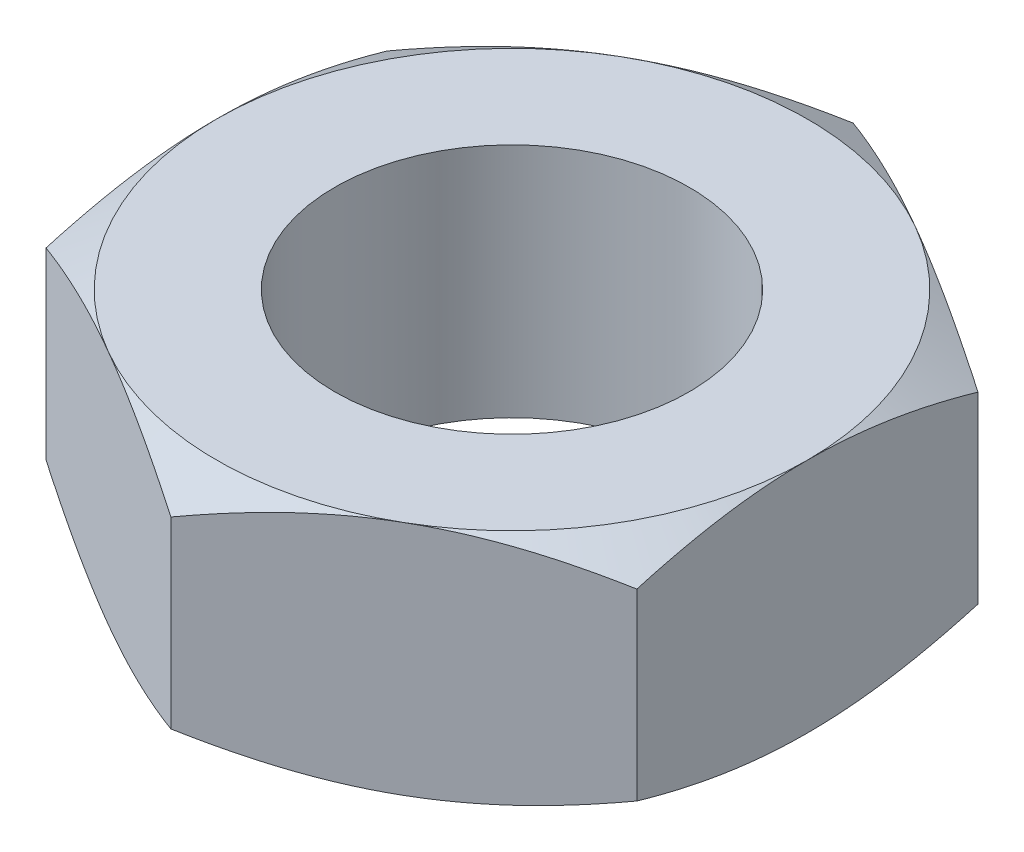
ISO-10303-21;
HEADER;
FILE_DESCRIPTION(('STEP AP214'),'2;1');
FILE_NAME('part.step','',(''),(''),'','','');
FILE_SCHEMA(('AUTOMOTIVE_DESIGN { 1 0 10303 214 1 1 1 1 }'));
ENDSEC;
DATA;
#1=APPLICATION_CONTEXT('core data for automotive mechanical design processes');
#2=APPLICATION_PROTOCOL_DEFINITION('international standard','automotive_design',2000,#1);
#3=PRODUCT_CONTEXT('',#1,'mechanical');
#4=PRODUCT('Part','Part','',(#3));
#5=PRODUCT_RELATED_PRODUCT_CATEGORY('part','',(#4));
#6=PRODUCT_DEFINITION_FORMATION('','',#4);
#7=PRODUCT_DEFINITION_CONTEXT('part definition',#1,'design');
#8=PRODUCT_DEFINITION('design','',#6,#7);
#9=PRODUCT_DEFINITION_SHAPE('','',#8);
#10=(LENGTH_UNIT() NAMED_UNIT(*) SI_UNIT(.MILLI.,.METRE.));
#11=(NAMED_UNIT(*) PLANE_ANGLE_UNIT() SI_UNIT($,.RADIAN.));
#12=(NAMED_UNIT(*) SI_UNIT($,.STERADIAN.) SOLID_ANGLE_UNIT());
#13=UNCERTAINTY_MEASURE_WITH_UNIT(LENGTH_MEASURE(1.E-05),#10,'distance_accuracy_value','');
#14=(GEOMETRIC_REPRESENTATION_CONTEXT(3) GLOBAL_UNCERTAINTY_ASSIGNED_CONTEXT((#13)) GLOBAL_UNIT_ASSIGNED_CONTEXT((#10,
#11,#12)) REPRESENTATION_CONTEXT('',''));
#15=CARTESIAN_POINT('',(0.,0.,0.));
#16=DIRECTION('',(0.,0.,1.));
#17=DIRECTION('',(1.,0.,0.));
#18=AXIS2_PLACEMENT_3D('',#15,#16,#17);
#19=CARTESIAN_POINT('',(2.5,2.,-1.44337567297407));
#20=DIRECTION('',(-0.5,0.,0.866025403784439));
#21=DIRECTION('',(0.866025403784439,0.,0.5));
#22=AXIS2_PLACEMENT_3D('',#19,#20,#21);
#23=PLANE('',#22);
#24=CARTESIAN_POINT('',(-0.000199999999999917,0.223357664359107,-2.88686681600197));
#25=CARTESIAN_POINT('',(0.109663234734871,0.186721620107625,-2.82343724785375));
#26=CARTESIAN_POINT('',(0.220474799896526,0.153402218965055,-2.75946016087834));
#27=CARTESIAN_POINT('',(0.44401683346605,0.0952422855578572,-2.63039810762178));
#28=CARTESIAN_POINT('',(0.556751274528388,0.0704223291477377,-2.5653108477275));
#29=CARTESIAN_POINT('',(0.780822993875269,0.0317856514410515,-2.43594298024479));
#30=CARTESIAN_POINT('',(0.892125791767377,0.0177117961856385,-2.37168227992023));
#31=CARTESIAN_POINT('',(1.11525522746833,0.000909152352749897,-2.24285844015415));
#32=CARTESIAN_POINT('',(1.22708105401423,-0.00183354879637364,-2.17829576909553));
#33=CARTESIAN_POINT('',(1.43604197555152,0.00386576000805342,-2.05765212479586));
#34=CARTESIAN_POINT('',(1.53320831755773,0.0109083943818616,-2.0015531110824));
#35=CARTESIAN_POINT('',(1.726907949711,0.0332314191249423,-1.88972057631678));
#36=CARTESIAN_POINT('',(1.82344056965973,0.0485194384402668,-1.8339874422038));
#37=CARTESIAN_POINT('',(2.01753972174048,0.0867390938444198,-1.7219242445005));
#38=CARTESIAN_POINT('',(2.11508168178214,0.109832776125516,-1.66560836761316));
#39=CARTESIAN_POINT('',(2.30871060807608,0.162246656577913,-1.55381665489446));
#40=CARTESIAN_POINT('',(2.40480005588618,0.191554535624548,-1.49833938633502));
#41=CARTESIAN_POINT('',(2.5002,0.223357664359108,-1.44326020292023));
#42=B_SPLINE_CURVE_WITH_KNOTS('',3,(#24,#25,#26,#27,#28,#29,#30,#31,#32,#33,#34,#35,#36,#37,#38,
#39,#40,#41),.UNSPECIFIED.,.F.,.F.,(4,2,2,2,2,2,2,2,4),(0.,0.396285827362226,0.79352433015205,
1.18093086852114,1.56786160134475,1.90479741793733,2.24204551660463,2.58677531536756,
2.93082800105256),.UNSPECIFIED.);
#43=CARTESIAN_POINT('',(0.,0.223290993692601,-2.88675134594813));
#44=VERTEX_POINT('',#43);
#45=CARTESIAN_POINT('',(1.25,0.,-2.1650635094611));
#46=VERTEX_POINT('',#45);
#47=EDGE_CURVE('E55',#44,#46,#42,.T.);
#48=ORIENTED_EDGE('',*,*,#47,.F.);
#49=DIRECTION('',(0.,-1.,0.));
#50=VECTOR('',#49,1.);
#51=CARTESIAN_POINT('',(0.,2.,-2.88675134594813));
#52=LINE('',#51,#50);
#53=CARTESIAN_POINT('',(0.,1.7767090063074,-2.88675134594813));
#54=VERTEX_POINT('',#53);
#55=EDGE_CURVE('E281',#54,#44,#52,.T.);
#56=ORIENTED_EDGE('',*,*,#55,.F.);
#57=CARTESIAN_POINT('',(2.5002,1.77664233564089,-1.44326020292023));
#58=CARTESIAN_POINT('',(2.39033676526513,1.81327837989237,-1.50668977106845));
#59=CARTESIAN_POINT('',(2.27952520010347,1.84659778103494,-1.57066685804385));
#60=CARTESIAN_POINT('',(2.05598316653395,1.90475771444214,-1.69972891130041));
#61=CARTESIAN_POINT('',(1.94324872547161,1.92957767085226,-1.7648161711947));
#62=CARTESIAN_POINT('',(1.71917700612473,1.96821434855895,-1.8941840386774));
#63=CARTESIAN_POINT('',(1.60787420823262,1.98228820381436,-1.95844473900197));
#64=CARTESIAN_POINT('',(1.38474477253167,1.99909084764725,-2.08726857876804));
#65=CARTESIAN_POINT('',(1.27291894598577,2.00183354879637,-2.15183124982667));
#66=CARTESIAN_POINT('',(1.06395802444848,1.99613423999195,-2.27247489412634));
#67=CARTESIAN_POINT('',(0.966791682442268,1.98909160561814,-2.32857390783979));
#68=CARTESIAN_POINT('',(0.773092050288997,1.96676858087506,-2.44040644260542));
#69=CARTESIAN_POINT('',(0.676559430340267,1.95148056155973,-2.4961395767184));
#70=CARTESIAN_POINT('',(0.482460278259524,1.91326090615558,-2.60820277442169));
#71=CARTESIAN_POINT('',(0.384918318217859,1.89016722387448,-2.66451865130903));
#72=CARTESIAN_POINT('',(0.191289391923915,1.83775334342209,-2.77631036402774));
#73=CARTESIAN_POINT('',(0.095199944113824,1.80844546437545,-2.83178763258717));
#74=CARTESIAN_POINT('',(-0.000199999999999958,1.77664233564089,-2.88686681600197));
#75=B_SPLINE_CURVE_WITH_KNOTS('',3,(#57,#58,#59,#60,#61,#62,#63,#64,#65,#66,#67,#68,#69,#70,#71,
#72,#73,#74),.UNSPECIFIED.,.F.,.F.,(4,2,2,2,2,2,2,2,4),(0.,0.396285827362227,0.793524330152051,
1.18093086852114,1.56786160134475,1.90479741793733,2.24204551660463,2.58677531536756,
2.93082800105256),.UNSPECIFIED.);
#76=CARTESIAN_POINT('',(1.25,2.,-2.1650635094611));
#77=VERTEX_POINT('',#76);
#78=EDGE_CURVE('E253',#77,#54,#75,.T.);
#79=ORIENTED_EDGE('',*,*,#78,.F.);
#80=CARTESIAN_POINT('',(2.5,1.7767090063074,-1.44337567297408));
#81=VERTEX_POINT('',#80);
#82=EDGE_CURVE('E321',#81,#77,#75,.T.);
#83=ORIENTED_EDGE('',*,*,#82,.F.);
#84=DIRECTION('',(0.,-1.,0.));
#85=VECTOR('',#84,1.);
#86=CARTESIAN_POINT('',(2.5,2.,-1.44337567297407));
#87=LINE('',#86,#85);
#88=CARTESIAN_POINT('',(2.5,0.223290993692601,-1.44337567297407));
#89=VERTEX_POINT('',#88);
#90=EDGE_CURVE('E323',#81,#89,#87,.T.);
#91=ORIENTED_EDGE('',*,*,#90,.T.);
#92=EDGE_CURVE('E140',#46,#89,#42,.T.);
#93=ORIENTED_EDGE('',*,*,#92,.F.);
#94=EDGE_LOOP('',(#48,#56,#79,#83,#91,#93));
#95=FACE_BOUND('',#94,.T.);
#96=ADVANCED_FACE('F39',(#95),#23,.F.);
#97=CARTESIAN_POINT('',(0.,2.,-2.88675134594813));
#98=DIRECTION('',(0.5,0.,0.866025403784439));
#99=DIRECTION('',(0.866025403784439,0.,-0.5));
#100=AXIS2_PLACEMENT_3D('',#97,#98,#99);
#101=PLANE('',#100);
#102=CARTESIAN_POINT('',(-2.5002,0.223357664359107,-1.44326020292023));
#103=CARTESIAN_POINT('',(-2.39033676526513,0.186721620107625,-1.50668977106845));
#104=CARTESIAN_POINT('',(-2.27952520010347,0.153402218965055,-1.57066685804385));
#105=CARTESIAN_POINT('',(-2.05598316653395,0.0952422855578569,-1.69972891130041));
#106=CARTESIAN_POINT('',(-1.94324872547161,0.0704223291477375,-1.7648161711947));
#107=CARTESIAN_POINT('',(-1.71917700612473,0.0317856514410513,-1.8941840386774));
#108=CARTESIAN_POINT('',(-1.60787420823262,0.0177117961856384,-1.95844473900197));
#109=CARTESIAN_POINT('',(-1.38474477253167,0.000909152352749717,-2.08726857876804));
#110=CARTESIAN_POINT('',(-1.27291894598577,-0.00183354879637401,-2.15183124982667));
#111=CARTESIAN_POINT('',(-1.06395802444848,0.00386576000805292,-2.27247489412634));
#112=CARTESIAN_POINT('',(-0.966791682442269,0.0109083943818612,-2.32857390783979));
#113=CARTESIAN_POINT('',(-0.773092050288997,0.033231419124942,-2.44040644260542));
#114=CARTESIAN_POINT('',(-0.676559430340268,0.0485194384402665,-2.49613957671839));
#115=CARTESIAN_POINT('',(-0.482460278259524,0.0867390938444195,-2.60820277442169));
#116=CARTESIAN_POINT('',(-0.384918318217859,0.109832776125516,-2.66451865130903));
#117=CARTESIAN_POINT('',(-0.191289391923915,0.162246656577912,-2.77631036402774));
#118=CARTESIAN_POINT('',(-0.0951999441138238,0.191554535624547,-2.83178763258717));
#119=CARTESIAN_POINT('',(0.000200000000000233,0.223357664359107,-2.88686681600197));
#120=B_SPLINE_CURVE_WITH_KNOTS('',3,(#102,#103,#104,#105,#106,#107,#108,#109,#110,#111,#112,
#113,#114,#115,#116,#117,#118,#119),.UNSPECIFIED.,.F.,.F.,(4,2,2,2,2,2,2,2,4),(0.,
0.396285827362227,0.793524330152051,1.18093086852114,1.56786160134475,1.90479741793733,
2.24204551660463,2.58677531536756,2.93082800105256),.UNSPECIFIED.);
#121=CARTESIAN_POINT('',(-2.5,0.223290993692601,-1.44337567297406));
#122=VERTEX_POINT('',#121);
#123=CARTESIAN_POINT('',(-1.25,0.,-2.1650635094611));
#124=VERTEX_POINT('',#123);
#125=EDGE_CURVE('E63',#122,#124,#120,.T.);
#126=ORIENTED_EDGE('',*,*,#125,.F.);
#127=DIRECTION('',(0.,-1.,0.));
#128=VECTOR('',#127,1.);
#129=CARTESIAN_POINT('',(-2.5,2.,-1.44337567297406));
#130=LINE('',#129,#128);
#131=CARTESIAN_POINT('',(-2.5,1.7767090063074,-1.44337567297406));
#132=VERTEX_POINT('',#131);
#133=EDGE_CURVE('E274',#132,#122,#130,.T.);
#134=ORIENTED_EDGE('',*,*,#133,.F.);
#135=CARTESIAN_POINT('',(0.000200000000000009,1.77664233564089,-2.88686681600197));
#136=CARTESIAN_POINT('',(-0.109663234734871,1.81327837989238,-2.82343724785375));
#137=CARTESIAN_POINT('',(-0.220474799896526,1.84659778103494,-2.75946016087834));
#138=CARTESIAN_POINT('',(-0.444016833466049,1.90475771444214,-2.63039810762178));
#139=CARTESIAN_POINT('',(-0.556751274528388,1.92957767085226,-2.5653108477275));
#140=CARTESIAN_POINT('',(-0.780822993875268,1.96821434855895,-2.43594298024479));
#141=CARTESIAN_POINT('',(-0.892125791767376,1.98228820381436,-2.37168227992023));
#142=CARTESIAN_POINT('',(-1.11525522746833,1.99909084764725,-2.24285844015415));
#143=CARTESIAN_POINT('',(-1.22708105401423,2.00183354879637,-2.17829576909552));
#144=CARTESIAN_POINT('',(-1.43604197555152,1.99613423999195,-2.05765212479586));
#145=CARTESIAN_POINT('',(-1.53320831755773,1.98909160561814,-2.0015531110824));
#146=CARTESIAN_POINT('',(-1.726907949711,1.96676858087506,-1.88972057631678));
#147=CARTESIAN_POINT('',(-1.82344056965973,1.95148056155973,-1.8339874422038));
#148=CARTESIAN_POINT('',(-2.01753972174048,1.91326090615558,-1.7219242445005));
#149=CARTESIAN_POINT('',(-2.11508168178214,1.89016722387448,-1.66560836761316));
#150=CARTESIAN_POINT('',(-2.30871060807608,1.83775334342209,-1.55381665489446));
#151=CARTESIAN_POINT('',(-2.40480005588618,1.80844546437545,-1.49833938633502));
#152=CARTESIAN_POINT('',(-2.5002,1.77664233564089,-1.44326020292023));
#153=B_SPLINE_CURVE_WITH_KNOTS('',3,(#135,#136,#137,#138,#139,#140,#141,#142,#143,#144,#145,
#146,#147,#148,#149,#150,#151,#152),.UNSPECIFIED.,.F.,.F.,(4,2,2,2,2,2,2,2,4),(0.,
0.396285827362227,0.79352433015205,1.18093086852114,1.56786160134475,1.90479741793733,
2.24204551660463,2.58677531536756,2.93082800105256),.UNSPECIFIED.);
#154=CARTESIAN_POINT('',(-1.25,2.,-2.1650635094611));
#155=VERTEX_POINT('',#154);
#156=EDGE_CURVE('E246',#155,#132,#153,.T.);
#157=ORIENTED_EDGE('',*,*,#156,.F.);
#158=EDGE_CURVE('E252',#54,#155,#153,.T.);
#159=ORIENTED_EDGE('',*,*,#158,.F.);
#160=ORIENTED_EDGE('',*,*,#55,.T.);
#161=EDGE_CURVE('E163',#124,#44,#120,.T.);
#162=ORIENTED_EDGE('',*,*,#161,.F.);
#163=EDGE_LOOP('',(#126,#134,#157,#159,#160,#162));
#164=FACE_BOUND('',#163,.T.);
#165=ADVANCED_FACE('F259',(#164),#101,.F.);
#166=CARTESIAN_POINT('',(-2.5,2.,-1.44337567297406));
#167=DIRECTION('',(1.,0.,0.));
#168=DIRECTION('',(0.,0.,-1.));
#169=AXIS2_PLACEMENT_3D('',#166,#167,#168);
#170=PLANE('',#169);
#171=CARTESIAN_POINT('',(-2.5,1.75051746805577,4.93486171933444));
#172=CARTESIAN_POINT('',(-2.5,1.69133726261722,4.8199403481942));
#173=CARTESIAN_POINT('',(-2.5,1.63247825676005,4.70485212642124));
#174=CARTESIAN_POINT('',(-2.5,1.51556406119456,4.47426567976795));
#175=CARTESIAN_POINT('',(-2.5,1.45750888635444,4.3587674473533));
#176=CARTESIAN_POINT('',(-2.5,1.34227244134488,4.12710089531368));
#177=CARTESIAN_POINT('',(-2.5,1.28509274407798,4.01093179192169));
#178=CARTESIAN_POINT('',(-2.5,1.17192590701674,3.77801122649482));
#179=CARTESIAN_POINT('',(-2.5,1.11593878415348,3.66125975622101));
#180=CARTESIAN_POINT('',(-2.5,1.00253157682963,3.42088300849687));
#181=CARTESIAN_POINT('',(-2.5,0.94519156160896,3.2972198482005));
#182=CARTESIAN_POINT('',(-2.5,0.832598686179216,3.04894788037271));
#183=CARTESIAN_POINT('',(-2.5,0.777345769924556,2.92433909834247));
#184=CARTESIAN_POINT('',(-2.5,0.669564709168184,2.67404231382757));
#185=CARTESIAN_POINT('',(-2.5,0.617034744165751,2.54835509963059));
#186=CARTESIAN_POINT('',(-2.5,0.515470603951828,2.29553518807958));
#187=CARTESIAN_POINT('',(-2.5,0.466437240853758,2.16840216282304));
#188=CARTESIAN_POINT('',(-2.5,0.36551904558916,1.89196933857389));
#189=CARTESIAN_POINT('',(-2.5,0.314430928565565,1.74237414052598));
#190=CARTESIAN_POINT('',(-2.5,0.220856049236354,1.4405551511059));
#191=CARTESIAN_POINT('',(-2.5,0.178364945289853,1.28833272889575));
#192=CARTESIAN_POINT('',(-2.5,0.105752289587979,0.983942199808397));
#193=CARTESIAN_POINT('',(-2.5,0.075408967281811,0.831829132495783));
#194=CARTESIAN_POINT('',(-2.5,0.0406516796303215,0.602071425625844));
#195=CARTESIAN_POINT('',(-2.5,0.0308592992319909,0.525228449493818));
#196=CARTESIAN_POINT('',(-2.5,0.0151636656794681,0.371150643177174));
#197=CARTESIAN_POINT('',(-2.5,0.00925981943211468,0.293915874561849));
#198=CARTESIAN_POINT('',(-2.5,0.00149945618362645,0.13817730801555));
#199=CARTESIAN_POINT('',(-2.5,-0.000300329680072945,0.0596706558577331));
#200=CARTESIAN_POINT('',(-2.5,0.000382182470508429,-0.097323703774756));
#201=CARTESIAN_POINT('',(-2.5,0.00286448024898932,-0.175811411250471));
#202=CARTESIAN_POINT('',(-2.5,0.0120180751018739,-0.332556462396659));
#203=CARTESIAN_POINT('',(-2.5,0.0186902391546215,-0.4108137550211));
#204=CARTESIAN_POINT('',(-2.5,0.0359818737124379,-0.566895759516455));
#205=CARTESIAN_POINT('',(-2.5,0.0466019878865531,-0.644720398746935));
#206=CARTESIAN_POINT('',(-2.5,0.0843776540425916,-0.880425277323257));
#207=CARTESIAN_POINT('',(-2.5,0.117244290445988,-1.0374021276822));
#208=CARTESIAN_POINT('',(-2.5,0.194551132550416,-1.34841101742391));
#209=CARTESIAN_POINT('',(-2.5,0.238994974726618,-1.50244211517955));
#210=CARTESIAN_POINT('',(-2.5,0.334467726657706,-1.80198948227857));
#211=CARTESIAN_POINT('',(-2.5,0.385183371784436,-1.94760725909514));
#212=CARTESIAN_POINT('',(-2.5,0.492317846941425,-2.23674360042291));
#213=CARTESIAN_POINT('',(-2.5,0.548738075330581,-2.38026164031033));
#214=CARTESIAN_POINT('',(-2.5,0.665809108984891,-2.66572180096044));
#215=CARTESIAN_POINT('',(-2.5,0.726464237701914,-2.80766213451906));
#216=CARTESIAN_POINT('',(-2.5,0.850881769521231,-3.0901760741915));
#217=CARTESIAN_POINT('',(-2.5,0.914644342755143,-3.23074960496675));
#218=CARTESIAN_POINT('',(-2.5,1.04081855009125,-3.50283338488746));
#219=CARTESIAN_POINT('',(-2.5,1.10310046173394,-3.63440403331771));
#220=CARTESIAN_POINT('',(-2.5,1.2292955254876,-3.89676431270017));
#221=CARTESIAN_POINT('',(-2.5,1.29320873128699,-4.02755391777178));
#222=CARTESIAN_POINT('',(-2.5,1.42210820195559,-4.28806433847912));
#223=CARTESIAN_POINT('',(-2.5,1.48709022600769,-4.41778725733017));
#224=CARTESIAN_POINT('',(-2.5,1.61808743263322,-4.67669676330922));
#225=CARTESIAN_POINT('',(-2.5,1.68410252583257,-4.8058833956229));
#226=CARTESIAN_POINT('',(-2.5,1.75051746805577,-4.93486171933444));
#227=B_SPLINE_CURVE_WITH_KNOTS('',3,(#171,#172,#173,#174,#175,#176,#177,#178,#179,#180,#181,
#182,#183,#184,#185,#186,#187,#188,#189,#190,#191,#192,#193,#194,#195,#196,#197,#198,#199,#200,
#201,#202,#203,#204,#205,#206,#207,#208,#209,#210,#211,#212,#213,#214,#215,#216,#217,#218,#219,
#220,#221,#222,#223,#224,#225,#226),.UNSPECIFIED.,.F.,.F.,(4,2,2,2,2,2,2,2,2,2,2,2,2,2,2,2,2,2,
2,2,2,2,2,2,2,2,2,4),(0.,0.387793831894924,0.775594827128251,1.16402581850152,1.5524623207934,
1.96137758264064,2.37028185592793,2.77890912291195,3.1876309897647,3.66167496284643,
4.13547893462243,4.60018855861607,4.83249783003165,5.06477166059454,5.30023727903514,
5.53570288450944,5.77121722921933,6.00676998875774,6.48725754661897,6.96789621109927,
7.43032586595213,7.89286915182352,8.35589175957823,8.81893974621792,9.25562834373433,
9.69233133192937,10.1275921173417,10.5628154528867),.UNSPECIFIED.);
#228=CARTESIAN_POINT('',(-2.5,0.223290993692601,1.44337567297407));
#229=VERTEX_POINT('',#228);
#230=CARTESIAN_POINT('',(-2.5,0.,0.));
#231=VERTEX_POINT('',#230);
#232=EDGE_CURVE('E350',#229,#231,#227,.T.);
#233=ORIENTED_EDGE('',*,*,#232,.F.);
#234=DIRECTION('',(0.,-1.,0.));
#235=VECTOR('',#234,1.);
#236=CARTESIAN_POINT('',(-2.5,2.,1.44337567297407));
#237=LINE('',#236,#235);
#238=CARTESIAN_POINT('',(-2.5,1.7767090063074,1.44337567297407));
#239=VERTEX_POINT('',#238);
#240=EDGE_CURVE('E282',#239,#229,#237,.T.);
#241=ORIENTED_EDGE('',*,*,#240,.F.);
#242=CARTESIAN_POINT('',(-2.5,0.249482531944229,-4.93486171933444));
#243=CARTESIAN_POINT('',(-2.5,0.308662737382783,-4.8199403481942));
#244=CARTESIAN_POINT('',(-2.5,0.367521743239952,-4.70485212642124));
#245=CARTESIAN_POINT('',(-2.5,0.484435938805442,-4.47426567976795));
#246=CARTESIAN_POINT('',(-2.5,0.542491113645565,-4.3587674473533));
#247=CARTESIAN_POINT('',(-2.5,0.657727558655124,-4.12710089531367));
#248=CARTESIAN_POINT('',(-2.5,0.714907255922024,-4.01093179192169));
#249=CARTESIAN_POINT('',(-2.5,0.828074092983265,-3.77801122649482));
#250=CARTESIAN_POINT('',(-2.5,0.884061215846522,-3.66125975622101));
#251=CARTESIAN_POINT('',(-2.5,0.997468423170369,-3.42088300849687));
#252=CARTESIAN_POINT('',(-2.5,1.05480843839104,-3.2972198482005));
#253=CARTESIAN_POINT('',(-2.5,1.16740131382078,-3.04894788037271));
#254=CARTESIAN_POINT('',(-2.5,1.22265423007544,-2.92433909834247));
#255=CARTESIAN_POINT('',(-2.5,1.33043529083182,-2.67404231382757));
#256=CARTESIAN_POINT('',(-2.5,1.38296525583425,-2.54835509963059));
#257=CARTESIAN_POINT('',(-2.5,1.48452939604817,-2.29553518807957));
#258=CARTESIAN_POINT('',(-2.5,1.53356275914624,-2.16840216282304));
#259=CARTESIAN_POINT('',(-2.5,1.63448095441084,-1.89196933857389));
#260=CARTESIAN_POINT('',(-2.5,1.68556907143444,-1.74237414052598));
#261=CARTESIAN_POINT('',(-2.5,1.77914395076365,-1.4405551511059));
#262=CARTESIAN_POINT('',(-2.5,1.82163505471015,-1.28833272889575));
#263=CARTESIAN_POINT('',(-2.5,1.89424771041202,-0.983942199808396));
#264=CARTESIAN_POINT('',(-2.5,1.92459103271819,-0.831829132495782));
#265=CARTESIAN_POINT('',(-2.5,1.95934832036968,-0.602071425625842));
#266=CARTESIAN_POINT('',(-2.5,1.96914070076801,-0.525228449493816));
#267=CARTESIAN_POINT('',(-2.5,1.98483633432053,-0.371150643177172));
#268=CARTESIAN_POINT('',(-2.5,1.99074018056789,-0.293915874561848));
#269=CARTESIAN_POINT('',(-2.5,1.99850054381637,-0.138177308015549));
#270=CARTESIAN_POINT('',(-2.5,2.00030032968007,-0.0596706558577319));
#271=CARTESIAN_POINT('',(-2.5,1.99961781752949,0.0973237037747572));
#272=CARTESIAN_POINT('',(-2.5,1.99713551975101,0.175811411250472));
#273=CARTESIAN_POINT('',(-2.5,1.98798192489813,0.332556462396661));
#274=CARTESIAN_POINT('',(-2.5,1.98130976084538,0.410813755021101));
#275=CARTESIAN_POINT('',(-2.5,1.96401812628756,0.566895759516457));
#276=CARTESIAN_POINT('',(-2.5,1.95339801211345,0.644720398746937));
#277=CARTESIAN_POINT('',(-2.5,1.91562234595741,0.880425277323259));
#278=CARTESIAN_POINT('',(-2.5,1.88275570955401,1.0374021276822));
#279=CARTESIAN_POINT('',(-2.5,1.80544886744958,1.34841101742391));
#280=CARTESIAN_POINT('',(-2.5,1.76100502527338,1.50244211517955));
#281=CARTESIAN_POINT('',(-2.5,1.66553227334229,1.80198948227857));
#282=CARTESIAN_POINT('',(-2.5,1.61481662821556,1.94760725909515));
#283=CARTESIAN_POINT('',(-2.5,1.50768215305858,2.23674360042291));
#284=CARTESIAN_POINT('',(-2.5,1.45126192466942,2.38026164031034));
#285=CARTESIAN_POINT('',(-2.5,1.33419089101511,2.66572180096044));
#286=CARTESIAN_POINT('',(-2.5,1.27353576229809,2.80766213451906));
#287=CARTESIAN_POINT('',(-2.5,1.14911823047877,3.0901760741915));
#288=CARTESIAN_POINT('',(-2.5,1.08535565724486,3.23074960496675));
#289=CARTESIAN_POINT('',(-2.5,0.959181449908748,3.50283338488746));
#290=CARTESIAN_POINT('',(-2.5,0.896899538266063,3.63440403331771));
#291=CARTESIAN_POINT('',(-2.5,0.770704474512404,3.89676431270018));
#292=CARTESIAN_POINT('',(-2.5,0.70679126871301,4.02755391777179));
#293=CARTESIAN_POINT('',(-2.5,0.57789179804441,4.28806433847913));
#294=CARTESIAN_POINT('',(-2.5,0.512909773992309,4.41778725733017));
#295=CARTESIAN_POINT('',(-2.5,0.381912567366777,4.67669676330922));
#296=CARTESIAN_POINT('',(-2.5,0.31589747416743,4.8058833956229));
#297=CARTESIAN_POINT('',(-2.5,0.249482531944229,4.93486171933444));
#298=B_SPLINE_CURVE_WITH_KNOTS('',3,(#242,#243,#244,#245,#246,#247,#248,#249,#250,#251,#252,
#253,#254,#255,#256,#257,#258,#259,#260,#261,#262,#263,#264,#265,#266,#267,#268,#269,#270,#271,
#272,#273,#274,#275,#276,#277,#278,#279,#280,#281,#282,#283,#284,#285,#286,#287,#288,#289,#290,
#291,#292,#293,#294,#295,#296,#297),.UNSPECIFIED.,.F.,.F.,(4,2,2,2,2,2,2,2,2,2,2,2,2,2,2,2,2,2,
2,2,2,2,2,2,2,2,2,4),(0.,0.387793831894924,0.775594827128251,1.16402581850152,1.5524623207934,
1.96137758264064,2.37028185592793,2.77890912291195,3.1876309897647,3.66167496284643,
4.13547893462243,4.60018855861607,4.83249783003166,5.06477166059454,5.30023727903514,
5.53570288450944,5.77121722921933,6.00676998875774,6.48725754661897,6.96789621109927,
7.43032586595213,7.89286915182352,8.35589175957823,8.81893974621792,9.25562834373433,
9.69233133192936,10.1275921173417,10.5628154528867),.UNSPECIFIED.);
#299=CARTESIAN_POINT('',(-2.5,2.,0.));
#300=VERTEX_POINT('',#299);
#301=EDGE_CURVE('E239',#300,#239,#298,.T.);
#302=ORIENTED_EDGE('',*,*,#301,.F.);
#303=EDGE_CURVE('E245',#132,#300,#298,.T.);
#304=ORIENTED_EDGE('',*,*,#303,.F.);
#305=ORIENTED_EDGE('',*,*,#133,.T.);
#306=EDGE_CURVE('E198',#231,#122,#227,.T.);
#307=ORIENTED_EDGE('',*,*,#306,.F.);
#308=EDGE_LOOP('',(#233,#241,#302,#304,#305,#307));
#309=FACE_BOUND('',#308,.T.);
#310=ADVANCED_FACE('F220',(#309),#170,.F.);
#311=CARTESIAN_POINT('',(-2.5,2.,1.44337567297407));
#312=DIRECTION('',(0.5,0.,-0.866025403784439));
#313=DIRECTION('',(-0.866025403784439,0.,-0.5));
#314=AXIS2_PLACEMENT_3D('',#311,#312,#313);
#315=PLANE('',#314);
#316=CARTESIAN_POINT('',(0.000200000000000467,0.223357664359108,2.88686681600197));
#317=CARTESIAN_POINT('',(-0.109663234734871,0.186721620107625,2.82343724785375));
#318=CARTESIAN_POINT('',(-0.220474799896525,0.153402218965056,2.75946016087834));
#319=CARTESIAN_POINT('',(-0.444016833466049,0.0952422855578572,2.63039810762178));
#320=CARTESIAN_POINT('',(-0.556751274528388,0.0704223291477378,2.5653108477275));
#321=CARTESIAN_POINT('',(-0.780822993875268,0.0317856514410516,2.43594298024479));
#322=CARTESIAN_POINT('',(-0.892125791767376,0.0177117961856386,2.37168227992023));
#323=CARTESIAN_POINT('',(-1.11525522746833,0.000909152352749866,2.24285844015415));
#324=CARTESIAN_POINT('',(-1.22708105401423,-0.00183354879637386,2.17829576909553));
#325=CARTESIAN_POINT('',(-1.43604197555152,0.00386576000805302,2.05765212479586));
#326=CARTESIAN_POINT('',(-1.53320831755773,0.0109083943818612,2.0015531110824));
#327=CARTESIAN_POINT('',(-1.726907949711,0.0332314191249421,1.88972057631678));
#328=CARTESIAN_POINT('',(-1.82344056965973,0.0485194384402667,1.8339874422038));
#329=CARTESIAN_POINT('',(-2.01753972174048,0.0867390938444197,1.7219242445005));
#330=CARTESIAN_POINT('',(-2.11508168178214,0.109832776125516,1.66560836761316));
#331=CARTESIAN_POINT('',(-2.30871060807608,0.162246656577912,1.55381665489446));
#332=CARTESIAN_POINT('',(-2.40480005588617,0.191554535624547,1.49833938633502));
#333=CARTESIAN_POINT('',(-2.5002,0.223357664359107,1.44326020292023));
#334=B_SPLINE_CURVE_WITH_KNOTS('',3,(#316,#317,#318,#319,#320,#321,#322,#323,#324,#325,#326,
#327,#328,#329,#330,#331,#332,#333),.UNSPECIFIED.,.F.,.F.,(4,2,2,2,2,2,2,2,4),(0.,
0.396285827362227,0.793524330152051,1.18093086852114,1.56786160134475,1.90479741793733,
2.24204551660463,2.58677531536756,2.93082800105256),.UNSPECIFIED.);
#335=CARTESIAN_POINT('',(0.,0.223290993692601,2.88675134594813));
#336=VERTEX_POINT('',#335);
#337=CARTESIAN_POINT('',(-1.25,0.,2.1650635094611));
#338=VERTEX_POINT('',#337);
#339=EDGE_CURVE('E149',#336,#338,#334,.T.);
#340=ORIENTED_EDGE('',*,*,#339,.F.);
#341=DIRECTION('',(0.,-1.,0.));
#342=VECTOR('',#341,1.);
#343=CARTESIAN_POINT('',(0.,2.,2.88675134594813));
#344=LINE('',#343,#342);
#345=CARTESIAN_POINT('',(0.,1.7767090063074,2.88675134594813));
#346=VERTEX_POINT('',#345);
#347=EDGE_CURVE('E162',#346,#336,#344,.T.);
#348=ORIENTED_EDGE('',*,*,#347,.F.);
#349=CARTESIAN_POINT('',(-2.5002,1.77664233564089,1.44326020292023));
#350=CARTESIAN_POINT('',(-2.39033676526513,1.81327837989237,1.50668977106845));
#351=CARTESIAN_POINT('',(-2.27952520010347,1.84659778103494,1.57066685804385));
#352=CARTESIAN_POINT('',(-2.05598316653395,1.90475771444214,1.69972891130041));
#353=CARTESIAN_POINT('',(-1.94324872547161,1.92957767085226,1.7648161711947));
#354=CARTESIAN_POINT('',(-1.71917700612473,1.96821434855895,1.8941840386774));
#355=CARTESIAN_POINT('',(-1.60787420823262,1.98228820381436,1.95844473900197));
#356=CARTESIAN_POINT('',(-1.38474477253167,1.99909084764725,2.08726857876804));
#357=CARTESIAN_POINT('',(-1.27291894598577,2.00183354879637,2.15183124982667));
#358=CARTESIAN_POINT('',(-1.06395802444848,1.99613423999195,2.27247489412634));
#359=CARTESIAN_POINT('',(-0.966791682442268,1.98909160561814,2.32857390783979));
#360=CARTESIAN_POINT('',(-0.773092050288996,1.96676858087506,2.44040644260542));
#361=CARTESIAN_POINT('',(-0.676559430340267,1.95148056155973,2.4961395767184));
#362=CARTESIAN_POINT('',(-0.482460278259523,1.91326090615558,2.60820277442169));
#363=CARTESIAN_POINT('',(-0.384918318217859,1.89016722387448,2.66451865130903));
#364=CARTESIAN_POINT('',(-0.191289391923914,1.83775334342209,2.77631036402774));
#365=CARTESIAN_POINT('',(-0.0951999441138235,1.80844546437545,2.83178763258717));
#366=CARTESIAN_POINT('',(0.000200000000000376,1.77664233564089,2.88686681600197));
#367=B_SPLINE_CURVE_WITH_KNOTS('',3,(#349,#350,#351,#352,#353,#354,#355,#356,#357,#358,#359,
#360,#361,#362,#363,#364,#365,#366),.UNSPECIFIED.,.F.,.F.,(4,2,2,2,2,2,2,2,4),(0.,
0.396285827362227,0.793524330152051,1.18093086852114,1.56786160134475,1.90479741793733,
2.24204551660463,2.58677531536756,2.93082800105256),.UNSPECIFIED.);
#368=CARTESIAN_POINT('',(-1.25,2.,2.1650635094611));
#369=VERTEX_POINT('',#368);
#370=EDGE_CURVE('E225',#369,#346,#367,.T.);
#371=ORIENTED_EDGE('',*,*,#370,.F.);
#372=EDGE_CURVE('E232',#239,#369,#367,.T.);
#373=ORIENTED_EDGE('',*,*,#372,.F.);
#374=ORIENTED_EDGE('',*,*,#240,.T.);
#375=EDGE_CURVE('E165',#338,#229,#334,.T.);
#376=ORIENTED_EDGE('',*,*,#375,.F.);
#377=EDGE_LOOP('',(#340,#348,#371,#373,#374,#376));
#378=FACE_BOUND('',#377,.T.);
#379=ADVANCED_FACE('F217',(#378),#315,.F.);
#380=CARTESIAN_POINT('',(0.,2.,2.88675134594813));
#381=DIRECTION('',(-0.5,0.,-0.866025403784439));
#382=DIRECTION('',(-0.866025403784439,0.,0.5));
#383=AXIS2_PLACEMENT_3D('',#380,#381,#382);
#384=PLANE('',#383);
#385=CARTESIAN_POINT('',(2.5002,0.223357664359108,1.44326020292023));
#386=CARTESIAN_POINT('',(2.39033676526513,0.186721620107626,1.50668977106845));
#387=CARTESIAN_POINT('',(2.27952520010347,0.153402218965056,1.57066685804385));
#388=CARTESIAN_POINT('',(2.05598316653395,0.0952422855578575,1.69972891130041));
#389=CARTESIAN_POINT('',(1.94324872547161,0.070422329147738,1.7648161711947));
#390=CARTESIAN_POINT('',(1.71917700612473,0.0317856514410518,1.8941840386774));
#391=CARTESIAN_POINT('',(1.60787420823262,0.017711796185639,1.95844473900197));
#392=CARTESIAN_POINT('',(1.38474477253167,0.000909152352750306,2.08726857876804));
#393=CARTESIAN_POINT('',(1.27291894598577,-0.00183354879637346,2.15183124982667));
#394=CARTESIAN_POINT('',(1.06395802444848,0.00386576000805338,2.27247489412634));
#395=CARTESIAN_POINT('',(0.966791682442269,0.0109083943818616,2.32857390783979));
#396=CARTESIAN_POINT('',(0.773092050288997,0.0332314191249424,2.44040644260542));
#397=CARTESIAN_POINT('',(0.676559430340268,0.0485194384402669,2.4961395767184));
#398=CARTESIAN_POINT('',(0.482460278259524,0.08673909384442,2.60820277442169));
#399=CARTESIAN_POINT('',(0.38491831821786,0.109832776125517,2.66451865130903));
#400=CARTESIAN_POINT('',(0.191289391923915,0.162246656577913,2.77631036402774));
#401=CARTESIAN_POINT('',(0.0951999441138241,0.191554535624548,2.83178763258717));
#402=CARTESIAN_POINT('',(-0.000199999999999809,0.223357664359108,2.88686681600197));
#403=B_SPLINE_CURVE_WITH_KNOTS('',3,(#385,#386,#387,#388,#389,#390,#391,#392,#393,#394,#395,
#396,#397,#398,#399,#400,#401,#402),.UNSPECIFIED.,.F.,.F.,(4,2,2,2,2,2,2,2,4),(0.,
0.396285827362227,0.79352433015205,1.18093086852114,1.56786160134475,1.90479741793733,
2.24204551660463,2.58677531536756,2.93082800105256),.UNSPECIFIED.);
#404=CARTESIAN_POINT('',(2.5,0.223290993692595,1.44337567297407));
#405=VERTEX_POINT('',#404);
#406=CARTESIAN_POINT('',(1.25,0.,2.1650635094611));
#407=VERTEX_POINT('',#406);
#408=EDGE_CURVE('E129',#405,#407,#403,.T.);
#409=ORIENTED_EDGE('',*,*,#408,.F.);
#410=DIRECTION('',(0.,-1.,0.));
#411=VECTOR('',#410,1.);
#412=CARTESIAN_POINT('',(2.5,2.,1.44337567297406));
#413=LINE('',#412,#411);
#414=CARTESIAN_POINT('',(2.5,1.7767090063074,1.44337567297406));
#415=VERTEX_POINT('',#414);
#416=EDGE_CURVE('E328',#415,#405,#413,.T.);
#417=ORIENTED_EDGE('',*,*,#416,.F.);
#418=CARTESIAN_POINT('',(-0.000199999999999607,1.77664233564089,2.88686681600197));
#419=CARTESIAN_POINT('',(0.109663234734871,1.81327837989237,2.82343724785375));
#420=CARTESIAN_POINT('',(0.220474799896526,1.84659778103494,2.75946016087834));
#421=CARTESIAN_POINT('',(0.44401683346605,1.90475771444214,2.63039810762178));
#422=CARTESIAN_POINT('',(0.556751274528388,1.92957767085226,2.5653108477275));
#423=CARTESIAN_POINT('',(0.780822993875269,1.96821434855895,2.43594298024479));
#424=CARTESIAN_POINT('',(0.892125791767377,1.98228820381436,2.37168227992023));
#425=CARTESIAN_POINT('',(1.11525522746833,1.99909084764725,2.24285844015415));
#426=CARTESIAN_POINT('',(1.22708105401423,2.00183354879637,2.17829576909553));
#427=CARTESIAN_POINT('',(1.43604197555152,1.99613423999195,2.05765212479586));
#428=CARTESIAN_POINT('',(1.53320831755773,1.98909160561814,2.0015531110824));
#429=CARTESIAN_POINT('',(1.726907949711,1.96676858087506,1.88972057631678));
#430=CARTESIAN_POINT('',(1.82344056965973,1.95148056155973,1.8339874422038));
#431=CARTESIAN_POINT('',(2.01753972174048,1.91326090615558,1.7219242445005));
#432=CARTESIAN_POINT('',(2.11508168178214,1.89016722387448,1.66560836761316));
#433=CARTESIAN_POINT('',(2.30871060807609,1.83775334342209,1.55381665489446));
#434=CARTESIAN_POINT('',(2.40480005588618,1.80844546437545,1.49833938633502));
#435=CARTESIAN_POINT('',(2.5002,1.77664233564089,1.44326020292023));
#436=B_SPLINE_CURVE_WITH_KNOTS('',3,(#418,#419,#420,#421,#422,#423,#424,#425,#426,#427,#428,
#429,#430,#431,#432,#433,#434,#435),.UNSPECIFIED.,.F.,.F.,(4,2,2,2,2,2,2,2,4),(0.,
0.396285827362226,0.793524330152051,1.18093086852114,1.56786160134475,1.90479741793733,
2.24204551660463,2.58677531536756,2.93082800105256),.UNSPECIFIED.);
#437=CARTESIAN_POINT('',(1.25,2.,2.1650635094611));
#438=VERTEX_POINT('',#437);
#439=EDGE_CURVE('E234',#438,#415,#436,.T.);
#440=ORIENTED_EDGE('',*,*,#439,.F.);
#441=EDGE_CURVE('E233',#346,#438,#436,.T.);
#442=ORIENTED_EDGE('',*,*,#441,.F.);
#443=ORIENTED_EDGE('',*,*,#347,.T.);
#444=EDGE_CURVE('E143',#407,#336,#403,.T.);
#445=ORIENTED_EDGE('',*,*,#444,.F.);
#446=EDGE_LOOP('',(#409,#417,#440,#442,#443,#445));
#447=FACE_BOUND('',#446,.T.);
#448=ADVANCED_FACE('F159',(#447),#384,.F.);
#449=CARTESIAN_POINT('',(2.5,2.,1.44337567297406));
#450=DIRECTION('',(-1.,0.,0.));
#451=DIRECTION('',(0.,0.,1.));
#452=AXIS2_PLACEMENT_3D('',#449,#450,#451);
#453=PLANE('',#452);
#454=CARTESIAN_POINT('',(2.5,1.75051746805577,-4.93486171933444));
#455=CARTESIAN_POINT('',(2.5,1.69133726261722,-4.8199403481942));
#456=CARTESIAN_POINT('',(2.5,1.63247825676005,-4.70485212642124));
#457=CARTESIAN_POINT('',(2.5,1.51556406119456,-4.47426567976795));
#458=CARTESIAN_POINT('',(2.5,1.45750888635444,-4.3587674473533));
#459=CARTESIAN_POINT('',(2.5,1.34227244134488,-4.12710089531368));
#460=CARTESIAN_POINT('',(2.5,1.28509274407798,-4.01093179192169));
#461=CARTESIAN_POINT('',(2.5,1.17192590701674,-3.77801122649482));
#462=CARTESIAN_POINT('',(2.5,1.11593878415348,-3.66125975622101));
#463=CARTESIAN_POINT('',(2.5,1.00253157682963,-3.42088300849687));
#464=CARTESIAN_POINT('',(2.5,0.945191561608959,-3.2972198482005));
#465=CARTESIAN_POINT('',(2.5,0.832598686179216,-3.04894788037271));
#466=CARTESIAN_POINT('',(2.5,0.777345769924556,-2.92433909834247));
#467=CARTESIAN_POINT('',(2.5,0.669564709168184,-2.67404231382757));
#468=CARTESIAN_POINT('',(2.5,0.617034744165751,-2.54835509963059));
#469=CARTESIAN_POINT('',(2.5,0.515470603951828,-2.29553518807958));
#470=CARTESIAN_POINT('',(2.5,0.466437240853758,-2.16840216282304));
#471=CARTESIAN_POINT('',(2.5,0.36551904558916,-1.89196933857389));
#472=CARTESIAN_POINT('',(2.5,0.314430928565565,-1.74237414052598));
#473=CARTESIAN_POINT('',(2.5,0.220856049236354,-1.4405551511059));
#474=CARTESIAN_POINT('',(2.5,0.178364945289853,-1.28833272889575));
#475=CARTESIAN_POINT('',(2.5,0.105752289587979,-0.983942199808397));
#476=CARTESIAN_POINT('',(2.5,0.0754089672818113,-0.831829132495783));
#477=CARTESIAN_POINT('',(2.5,0.0406516796303215,-0.602071425625843));
#478=CARTESIAN_POINT('',(2.5,0.0308592992319908,-0.525228449493817));
#479=CARTESIAN_POINT('',(2.5,0.015163665679468,-0.371150643177173));
#480=CARTESIAN_POINT('',(2.5,0.00925981943211472,-0.293915874561849));
#481=CARTESIAN_POINT('',(2.5,0.00149945618362661,-0.13817730801555));
#482=CARTESIAN_POINT('',(2.5,-0.000300329680072817,-0.0596706558577331));
#483=CARTESIAN_POINT('',(2.5,0.000382182470508555,0.097323703774756));
#484=CARTESIAN_POINT('',(2.5,0.00286448024898947,0.175811411250471));
#485=CARTESIAN_POINT('',(2.5,0.012018075101874,0.33255646239666));
#486=CARTESIAN_POINT('',(2.5,0.0186902391546216,0.4108137550211));
#487=CARTESIAN_POINT('',(2.5,0.035981873712438,0.566895759516456));
#488=CARTESIAN_POINT('',(2.5,0.0466019878865533,0.644720398746936));
#489=CARTESIAN_POINT('',(2.5,0.0843776540425918,0.880425277323258));
#490=CARTESIAN_POINT('',(2.5,0.117244290445989,1.0374021276822));
#491=CARTESIAN_POINT('',(2.5,0.194551132550416,1.34841101742391));
#492=CARTESIAN_POINT('',(2.5,0.238994974726619,1.50244211517955));
#493=CARTESIAN_POINT('',(2.5,0.334467726657706,1.80198948227857));
#494=CARTESIAN_POINT('',(2.5,0.385183371784436,1.94760725909514));
#495=CARTESIAN_POINT('',(2.5,0.492317846941425,2.23674360042291));
#496=CARTESIAN_POINT('',(2.5,0.548738075330581,2.38026164031033));
#497=CARTESIAN_POINT('',(2.5,0.665809108984891,2.66572180096044));
#498=CARTESIAN_POINT('',(2.5,0.726464237701915,2.80766213451906));
#499=CARTESIAN_POINT('',(2.5,0.850881769521233,3.0901760741915));
#500=CARTESIAN_POINT('',(2.5,0.914644342755144,3.23074960496675));
#501=CARTESIAN_POINT('',(2.5,1.04081855009125,3.50283338488747));
#502=CARTESIAN_POINT('',(2.5,1.10310046173394,3.63440403331771));
#503=CARTESIAN_POINT('',(2.5,1.2292955254876,3.89676431270018));
#504=CARTESIAN_POINT('',(2.5,1.29320873128699,4.02755391777178));
#505=CARTESIAN_POINT('',(2.5,1.42210820195559,4.28806433847912));
#506=CARTESIAN_POINT('',(2.5,1.48709022600769,4.41778725733018));
#507=CARTESIAN_POINT('',(2.5,1.61808743263322,4.67669676330922));
#508=CARTESIAN_POINT('',(2.5,1.68410252583257,4.8058833956229));
#509=CARTESIAN_POINT('',(2.5,1.75051746805577,4.93486171933444));
#510=B_SPLINE_CURVE_WITH_KNOTS('',3,(#454,#455,#456,#457,#458,#459,#460,#461,#462,#463,#464,
#465,#466,#467,#468,#469,#470,#471,#472,#473,#474,#475,#476,#477,#478,#479,#480,#481,#482,#483,
#484,#485,#486,#487,#488,#489,#490,#491,#492,#493,#494,#495,#496,#497,#498,#499,#500,#501,#502,
#503,#504,#505,#506,#507,#508,#509),.UNSPECIFIED.,.F.,.F.,(4,2,2,2,2,2,2,2,2,2,2,2,2,2,2,2,2,2,
2,2,2,2,2,2,2,2,2,4),(0.,0.387793831894924,0.775594827128251,1.16402581850153,1.5524623207934,
1.96137758264064,2.37028185592793,2.77890912291195,3.1876309897647,3.66167496284643,
4.13547893462243,4.60018855861608,4.83249783003166,5.06477166059454,5.30023727903514,
5.53570288450944,5.77121722921933,6.00676998875775,6.48725754661897,6.96789621109928,
7.43032586595214,7.89286915182353,8.35589175957824,8.81893974621792,9.25562834373433,
9.69233133192937,10.1275921173417,10.5628154528867),.UNSPECIFIED.);
#511=CARTESIAN_POINT('',(2.5,0.,0.));
#512=VERTEX_POINT('',#511);
#513=EDGE_CURVE('E141',#89,#512,#510,.T.);
#514=ORIENTED_EDGE('',*,*,#513,.F.);
#515=ORIENTED_EDGE('',*,*,#90,.F.);
#516=CARTESIAN_POINT('',(2.5,0.249482531944228,4.93486171933444));
#517=CARTESIAN_POINT('',(2.5,0.308662737382782,4.8199403481942));
#518=CARTESIAN_POINT('',(2.5,0.367521743239951,4.70485212642124));
#519=CARTESIAN_POINT('',(2.5,0.484435938805441,4.47426567976795));
#520=CARTESIAN_POINT('',(2.5,0.542491113645564,4.3587674473533));
#521=CARTESIAN_POINT('',(2.5,0.657727558655124,4.12710089531367));
#522=CARTESIAN_POINT('',(2.5,0.714907255922024,4.01093179192169));
#523=CARTESIAN_POINT('',(2.5,0.828074092983265,3.77801122649482));
#524=CARTESIAN_POINT('',(2.5,0.884061215846522,3.66125975622101));
#525=CARTESIAN_POINT('',(2.5,0.997468423170368,3.42088300849687));
#526=CARTESIAN_POINT('',(2.5,1.05480843839104,3.2972198482005));
#527=CARTESIAN_POINT('',(2.5,1.16740131382078,3.04894788037271));
#528=CARTESIAN_POINT('',(2.5,1.22265423007544,2.92433909834247));
#529=CARTESIAN_POINT('',(2.5,1.33043529083182,2.67404231382757));
#530=CARTESIAN_POINT('',(2.5,1.38296525583425,2.54835509963059));
#531=CARTESIAN_POINT('',(2.5,1.48452939604817,2.29553518807957));
#532=CARTESIAN_POINT('',(2.5,1.53356275914624,2.16840216282304));
#533=CARTESIAN_POINT('',(2.5,1.63448095441084,1.89196933857388));
#534=CARTESIAN_POINT('',(2.5,1.68556907143444,1.74237414052597));
#535=CARTESIAN_POINT('',(2.5,1.77914395076365,1.4405551511059));
#536=CARTESIAN_POINT('',(2.5,1.82163505471015,1.28833272889575));
#537=CARTESIAN_POINT('',(2.5,1.89424771041202,0.983942199808395));
#538=CARTESIAN_POINT('',(2.5,1.92459103271819,0.831829132495782));
#539=CARTESIAN_POINT('',(2.5,1.95934832036968,0.602071425625842));
#540=CARTESIAN_POINT('',(2.5,1.96914070076801,0.525228449493816));
#541=CARTESIAN_POINT('',(2.5,1.98483633432053,0.371150643177172));
#542=CARTESIAN_POINT('',(2.5,1.99074018056789,0.293915874561847));
#543=CARTESIAN_POINT('',(2.5,1.99850054381637,0.138177308015549));
#544=CARTESIAN_POINT('',(2.5,2.00030032968007,0.0596706558577314));
#545=CARTESIAN_POINT('',(2.5,1.99961781752949,-0.0973237037747578));
#546=CARTESIAN_POINT('',(2.5,1.99713551975101,-0.175811411250473));
#547=CARTESIAN_POINT('',(2.5,1.98798192489813,-0.332556462396661));
#548=CARTESIAN_POINT('',(2.5,1.98130976084538,-0.410813755021102));
#549=CARTESIAN_POINT('',(2.5,1.96401812628756,-0.566895759516457));
#550=CARTESIAN_POINT('',(2.5,1.95339801211345,-0.644720398746937));
#551=CARTESIAN_POINT('',(2.5,1.91562234595741,-0.880425277323259));
#552=CARTESIAN_POINT('',(2.5,1.88275570955401,-1.0374021276822));
#553=CARTESIAN_POINT('',(2.5,1.80544886744958,-1.34841101742391));
#554=CARTESIAN_POINT('',(2.5,1.76100502527338,-1.50244211517955));
#555=CARTESIAN_POINT('',(2.5,1.66553227334229,-1.80198948227857));
#556=CARTESIAN_POINT('',(2.5,1.61481662821556,-1.94760725909515));
#557=CARTESIAN_POINT('',(2.5,1.50768215305858,-2.23674360042291));
#558=CARTESIAN_POINT('',(2.5,1.45126192466942,-2.38026164031034));
#559=CARTESIAN_POINT('',(2.5,1.33419089101511,-2.66572180096044));
#560=CARTESIAN_POINT('',(2.5,1.27353576229809,-2.80766213451906));
#561=CARTESIAN_POINT('',(2.5,1.14911823047877,-3.0901760741915));
#562=CARTESIAN_POINT('',(2.5,1.08535565724486,-3.23074960496675));
#563=CARTESIAN_POINT('',(2.5,0.959181449908748,-3.50283338488747));
#564=CARTESIAN_POINT('',(2.5,0.896899538266062,-3.63440403331771));
#565=CARTESIAN_POINT('',(2.5,0.770704474512404,-3.89676431270018));
#566=CARTESIAN_POINT('',(2.5,0.706791268713009,-4.02755391777179));
#567=CARTESIAN_POINT('',(2.5,0.57789179804441,-4.28806433847913));
#568=CARTESIAN_POINT('',(2.5,0.512909773992309,-4.41778725733018));
#569=CARTESIAN_POINT('',(2.5,0.381912567366777,-4.67669676330922));
#570=CARTESIAN_POINT('',(2.5,0.315897474167429,-4.8058833956229));
#571=CARTESIAN_POINT('',(2.5,0.249482531944229,-4.93486171933444));
#572=B_SPLINE_CURVE_WITH_KNOTS('',3,(#516,#517,#518,#519,#520,#521,#522,#523,#524,#525,#526,
#527,#528,#529,#530,#531,#532,#533,#534,#535,#536,#537,#538,#539,#540,#541,#542,#543,#544,#545,
#546,#547,#548,#549,#550,#551,#552,#553,#554,#555,#556,#557,#558,#559,#560,#561,#562,#563,#564,
#565,#566,#567,#568,#569,#570,#571),.UNSPECIFIED.,.F.,.F.,(4,2,2,2,2,2,2,2,2,2,2,2,2,2,2,2,2,2,
2,2,2,2,2,2,2,2,2,4),(0.,0.387793831894924,0.775594827128252,1.16402581850153,1.5524623207934,
1.96137758264064,2.37028185592793,2.77890912291195,3.1876309897647,3.66167496284643,
4.13547893462243,4.60018855861608,4.83249783003166,5.06477166059454,5.30023727903514,
5.53570288450944,5.77121722921933,6.00676998875775,6.48725754661897,6.96789621109928,
7.43032586595214,7.89286915182353,8.35589175957823,8.81893974621792,9.25562834373433,
9.69233133192937,10.1275921173417,10.5628154528867),.UNSPECIFIED.);
#573=CARTESIAN_POINT('',(2.5,2.,0.));
#574=VERTEX_POINT('',#573);
#575=EDGE_CURVE('E284',#574,#81,#572,.T.);
#576=ORIENTED_EDGE('',*,*,#575,.F.);
#577=EDGE_CURVE('E154',#415,#574,#572,.T.);
#578=ORIENTED_EDGE('',*,*,#577,.F.);
#579=ORIENTED_EDGE('',*,*,#416,.T.);
#580=EDGE_CURVE('E135',#512,#405,#510,.T.);
#581=ORIENTED_EDGE('',*,*,#580,.F.);
#582=EDGE_LOOP('',(#514,#515,#576,#578,#579,#581));
#583=FACE_BOUND('',#582,.T.);
#584=ADVANCED_FACE('F293',(#583),#453,.F.);
#585=CARTESIAN_POINT('',(0.,0.,0.));
#586=DIRECTION('',(0.,1.,0.));
#587=DIRECTION('',(0.,0.,1.));
#588=AXIS2_PLACEMENT_3D('',#585,#586,#587);
#589=PLANE('',#588);
#590=CARTESIAN_POINT('',(0.,0.,0.));
#591=DIRECTION('',(0.,1.,0.));
#592=DIRECTION('',(0.,0.,1.));
#593=AXIS2_PLACEMENT_3D('',#590,#591,#592);
#594=CIRCLE('',#593,1.5);
#595=CARTESIAN_POINT('',(0.,0.,1.5));
#596=VERTEX_POINT('',#595);
#597=EDGE_CURVE('E320',#596,#596,#594,.T.);
#598=ORIENTED_EDGE('',*,*,#597,.T.);
#599=EDGE_LOOP('',(#598));
#600=FACE_BOUND('',#599,.T.);
#601=CARTESIAN_POINT('',(0.,0.,0.));
#602=DIRECTION('',(0.,1.,0.));
#603=DIRECTION('',(0.,0.,1.));
#604=AXIS2_PLACEMENT_3D('',#601,#602,#603);
#605=CIRCLE('',#604,2.5);
#606=EDGE_CURVE('E12',#407,#512,#605,.T.);
#607=ORIENTED_EDGE('',*,*,#606,.F.);
#608=EDGE_CURVE('E43',#338,#407,#605,.T.);
#609=ORIENTED_EDGE('',*,*,#608,.F.);
#610=EDGE_CURVE('E153',#231,#338,#605,.T.);
#611=ORIENTED_EDGE('',*,*,#610,.F.);
#612=EDGE_CURVE('E510',#124,#231,#605,.T.);
#613=ORIENTED_EDGE('',*,*,#612,.F.);
#614=EDGE_CURVE('E48',#46,#124,#605,.T.);
#615=ORIENTED_EDGE('',*,*,#614,.F.);
#616=CARTESIAN_POINT('',(0.,0.,0.));
#617=DIRECTION('',(0.,-1.,0.));
#618=DIRECTION('',(0.,0.,-1.));
#619=AXIS2_PLACEMENT_3D('',#616,#617,#618);
#620=CIRCLE('',#619,2.5);
#621=EDGE_CURVE('E157',#46,#512,#620,.T.);
#622=ORIENTED_EDGE('',*,*,#621,.T.);
#623=EDGE_LOOP('',(#607,#609,#611,#613,#615,#622));
#624=FACE_BOUND('',#623,.T.);
#625=ADVANCED_FACE('F155',(#600,#624),#589,.F.);
#626=CARTESIAN_POINT('',(0.,2.,0.));
#627=DIRECTION('',(0.,1.,0.));
#628=DIRECTION('',(0.,0.,1.));
#629=AXIS2_PLACEMENT_3D('',#626,#627,#628);
#630=PLANE('',#629);
#631=CARTESIAN_POINT('',(0.,2.,0.));
#632=DIRECTION('',(0.,1.,0.));
#633=DIRECTION('',(0.,0.,1.));
#634=AXIS2_PLACEMENT_3D('',#631,#632,#633);
#635=CIRCLE('',#634,1.5);
#636=CARTESIAN_POINT('',(0.,2.,1.5));
#637=VERTEX_POINT('',#636);
#638=EDGE_CURVE('E317',#637,#637,#635,.T.);
#639=ORIENTED_EDGE('',*,*,#638,.F.);
#640=EDGE_LOOP('',(#639));
#641=FACE_BOUND('',#640,.T.);
#642=CARTESIAN_POINT('',(0.,2.,0.));
#643=DIRECTION('',(0.,1.,0.));
#644=DIRECTION('',(0.,0.,1.));
#645=AXIS2_PLACEMENT_3D('',#642,#643,#644);
#646=CIRCLE('',#645,2.5);
#647=EDGE_CURVE('E339',#369,#438,#646,.T.);
#648=ORIENTED_EDGE('',*,*,#647,.T.);
#649=EDGE_CURVE('E335',#438,#574,#646,.T.);
#650=ORIENTED_EDGE('',*,*,#649,.T.);
#651=EDGE_CURVE('E346',#574,#77,#646,.T.);
#652=ORIENTED_EDGE('',*,*,#651,.T.);
#653=EDGE_CURVE('E357',#77,#155,#646,.T.);
#654=ORIENTED_EDGE('',*,*,#653,.T.);
#655=EDGE_CURVE('E351',#155,#300,#646,.T.);
#656=ORIENTED_EDGE('',*,*,#655,.T.);
#657=EDGE_CURVE('E349',#300,#369,#646,.T.);
#658=ORIENTED_EDGE('',*,*,#657,.T.);
#659=EDGE_LOOP('',(#648,#650,#652,#654,#656,#658));
#660=FACE_BOUND('',#659,.T.);
#661=ADVANCED_FACE('F301',(#641,#660),#630,.T.);
#662=CARTESIAN_POINT('',(0.,2.,0.));
#663=DIRECTION('',(0.,-1.,0.));
#664=DIRECTION('',(0.,0.,-1.));
#665=AXIS2_PLACEMENT_3D('',#662,#663,#664);
#666=CYLINDRICAL_SURFACE('',#665,1.5);
#667=ORIENTED_EDGE('',*,*,#638,.T.);
#668=EDGE_LOOP('',(#667));
#669=FACE_BOUND('',#668,.T.);
#670=ORIENTED_EDGE('',*,*,#597,.F.);
#671=EDGE_LOOP('',(#670));
#672=FACE_BOUND('',#671,.T.);
#673=ADVANCED_FACE('F304',(#669,#672),#666,.F.);
#674=CARTESIAN_POINT('',(0.,2.,0.));
#675=DIRECTION('',(0.,-1.,0.));
#676=DIRECTION('',(0.,0.,1.));
#677=AXIS2_PLACEMENT_3D('',#674,#675,#676);
#678=CONICAL_SURFACE('',#677,2.5,1.0471975511966);
#679=ORIENTED_EDGE('',*,*,#82,.T.);
#680=ORIENTED_EDGE('',*,*,#651,.F.);
#681=ORIENTED_EDGE('',*,*,#575,.T.);
#682=EDGE_LOOP('',(#679,#680,#681));
#683=FACE_BOUND('',#682,.T.);
#684=ADVANCED_FACE('F192',(#683),#678,.T.);
#685=ORIENTED_EDGE('',*,*,#439,.T.);
#686=ORIENTED_EDGE('',*,*,#577,.T.);
#687=ORIENTED_EDGE('',*,*,#649,.F.);
#688=EDGE_LOOP('',(#685,#686,#687));
#689=FACE_BOUND('',#688,.T.);
#690=ADVANCED_FACE('F311',(#689),#678,.T.);
#691=ORIENTED_EDGE('',*,*,#370,.T.);
#692=ORIENTED_EDGE('',*,*,#441,.T.);
#693=ORIENTED_EDGE('',*,*,#647,.F.);
#694=EDGE_LOOP('',(#691,#692,#693));
#695=FACE_BOUND('',#694,.T.);
#696=ADVANCED_FACE('F337',(#695),#678,.T.);
#697=ORIENTED_EDGE('',*,*,#301,.T.);
#698=ORIENTED_EDGE('',*,*,#372,.T.);
#699=ORIENTED_EDGE('',*,*,#657,.F.);
#700=EDGE_LOOP('',(#697,#698,#699));
#701=FACE_BOUND('',#700,.T.);
#702=ADVANCED_FACE('F355',(#701),#678,.T.);
#703=ORIENTED_EDGE('',*,*,#156,.T.);
#704=ORIENTED_EDGE('',*,*,#303,.T.);
#705=ORIENTED_EDGE('',*,*,#655,.F.);
#706=EDGE_LOOP('',(#703,#704,#705));
#707=FACE_BOUND('',#706,.T.);
#708=ADVANCED_FACE('F367',(#707),#678,.T.);
#709=ORIENTED_EDGE('',*,*,#78,.T.);
#710=ORIENTED_EDGE('',*,*,#158,.T.);
#711=ORIENTED_EDGE('',*,*,#653,.F.);
#712=EDGE_LOOP('',(#709,#710,#711));
#713=FACE_BOUND('',#712,.T.);
#714=ADVANCED_FACE('F313',(#713),#678,.T.);
#715=CARTESIAN_POINT('',(0.,0.,0.));
#716=DIRECTION('',(0.,1.,0.));
#717=DIRECTION('',(0.,0.,-1.));
#718=AXIS2_PLACEMENT_3D('',#715,#716,#717);
#719=CONICAL_SURFACE('',#718,2.5,1.0471975511966);
#720=ORIENTED_EDGE('',*,*,#339,.T.);
#721=ORIENTED_EDGE('',*,*,#608,.T.);
#722=ORIENTED_EDGE('',*,*,#444,.T.);
#723=EDGE_LOOP('',(#720,#721,#722));
#724=FACE_BOUND('',#723,.T.);
#725=ADVANCED_FACE('F147',(#724),#719,.T.);
#726=ORIENTED_EDGE('',*,*,#232,.T.);
#727=ORIENTED_EDGE('',*,*,#610,.T.);
#728=ORIENTED_EDGE('',*,*,#375,.T.);
#729=EDGE_LOOP('',(#726,#727,#728));
#730=FACE_BOUND('',#729,.T.);
#731=ADVANCED_FACE('F186',(#730),#719,.T.);
#732=ORIENTED_EDGE('',*,*,#306,.T.);
#733=ORIENTED_EDGE('',*,*,#125,.T.);
#734=ORIENTED_EDGE('',*,*,#612,.T.);
#735=EDGE_LOOP('',(#732,#733,#734));
#736=FACE_BOUND('',#735,.T.);
#737=ADVANCED_FACE('F190',(#736),#719,.T.);
#738=ORIENTED_EDGE('',*,*,#161,.T.);
#739=ORIENTED_EDGE('',*,*,#47,.T.);
#740=ORIENTED_EDGE('',*,*,#614,.T.);
#741=EDGE_LOOP('',(#738,#739,#740));
#742=FACE_BOUND('',#741,.T.);
#743=ADVANCED_FACE('F470',(#742),#719,.T.);
#744=ORIENTED_EDGE('',*,*,#92,.T.);
#745=ORIENTED_EDGE('',*,*,#513,.T.);
#746=ORIENTED_EDGE('',*,*,#621,.F.);
#747=EDGE_LOOP('',(#744,#745,#746));
#748=FACE_BOUND('',#747,.T.);
#749=ADVANCED_FACE('F469',(#748),#719,.T.);
#750=ORIENTED_EDGE('',*,*,#408,.T.);
#751=ORIENTED_EDGE('',*,*,#606,.T.);
#752=ORIENTED_EDGE('',*,*,#580,.T.);
#753=EDGE_LOOP('',(#750,#751,#752));
#754=FACE_BOUND('',#753,.T.);
#755=ADVANCED_FACE('F131',(#754),#719,.T.);
#756=CLOSED_SHELL('',(#96,#165,#310,#379,#448,#584,#625,#661,#673,#684,#690,#696,#702,#708,#714,
#725,#731,#737,#743,#749,#755));
#757=MANIFOLD_SOLID_BREP('B2',#756);
#758=ADVANCED_BREP_SHAPE_REPRESENTATION('',(#18,#757),#14);
#759=SHAPE_DEFINITION_REPRESENTATION(#9,#758);
ENDSEC;
END-ISO-10303-21;
